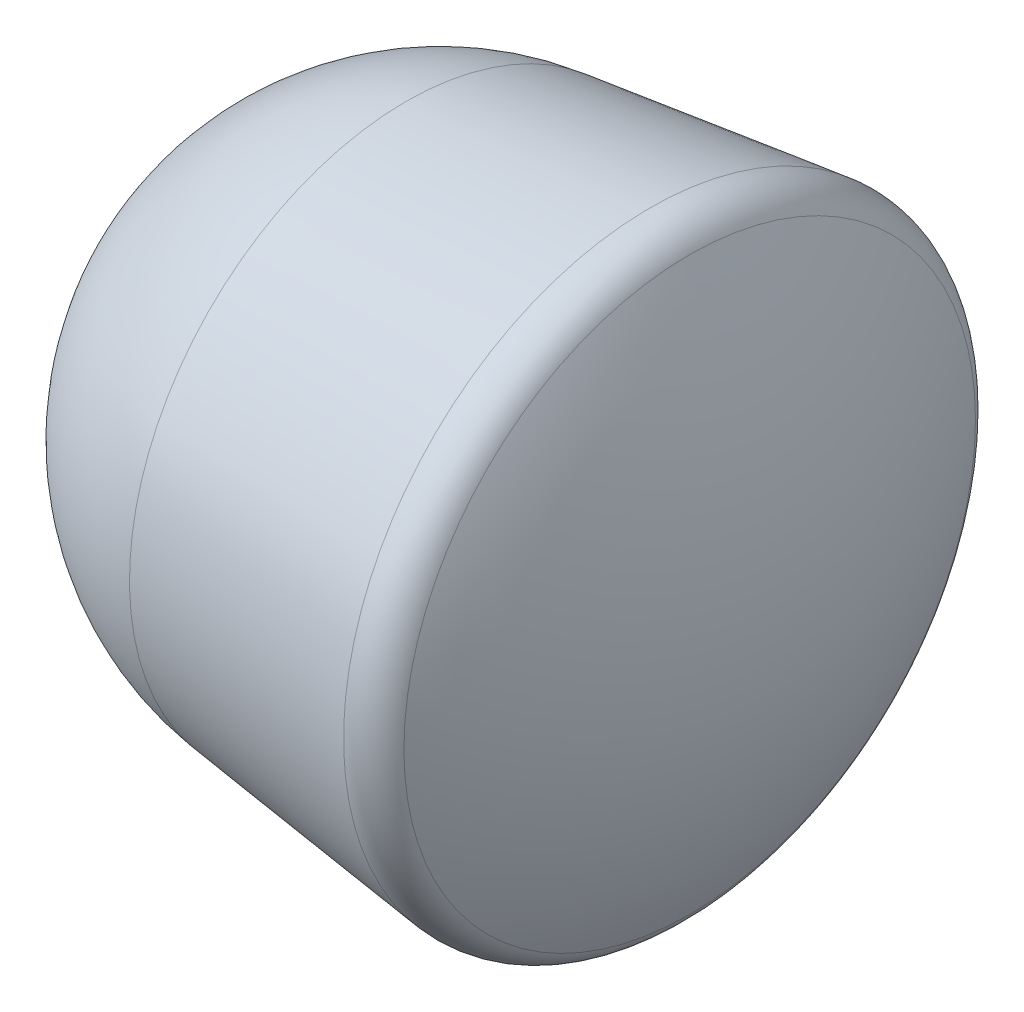
ISO-10303-21;
HEADER;
FILE_DESCRIPTION(('STEP AP214'),'2;1');
FILE_NAME('part.step','',(''),(''),'','','');
FILE_SCHEMA(('AUTOMOTIVE_DESIGN { 1 0 10303 214 1 1 1 1 }'));
ENDSEC;
DATA;
#1=APPLICATION_CONTEXT('core data for automotive mechanical design processes');
#2=APPLICATION_PROTOCOL_DEFINITION('international standard','automotive_design',2000,#1);
#3=PRODUCT_CONTEXT('',#1,'mechanical');
#4=PRODUCT('Part','Part','',(#3));
#5=PRODUCT_RELATED_PRODUCT_CATEGORY('part','',(#4));
#6=PRODUCT_DEFINITION_FORMATION('','',#4);
#7=PRODUCT_DEFINITION_CONTEXT('part definition',#1,'design');
#8=PRODUCT_DEFINITION('design','',#6,#7);
#9=PRODUCT_DEFINITION_SHAPE('','',#8);
#10=(LENGTH_UNIT() NAMED_UNIT(*) SI_UNIT(.MILLI.,.METRE.));
#11=(NAMED_UNIT(*) PLANE_ANGLE_UNIT() SI_UNIT($,.RADIAN.));
#12=(NAMED_UNIT(*) SI_UNIT($,.STERADIAN.) SOLID_ANGLE_UNIT());
#13=UNCERTAINTY_MEASURE_WITH_UNIT(LENGTH_MEASURE(1.E-05),#10,'distance_accuracy_value','');
#14=(GEOMETRIC_REPRESENTATION_CONTEXT(3) GLOBAL_UNCERTAINTY_ASSIGNED_CONTEXT((#13)) GLOBAL_UNIT_ASSIGNED_CONTEXT((#10,
#11,#12)) REPRESENTATION_CONTEXT('',''));
#15=CARTESIAN_POINT('',(0.,0.,0.));
#16=DIRECTION('',(0.,0.,1.));
#17=DIRECTION('',(1.,0.,0.));
#18=AXIS2_PLACEMENT_3D('',#15,#16,#17);
#19=CARTESIAN_POINT('',(998.991394359836,-1.45716771982052E-13,0.));
#20=DIRECTION('',(1.,0.,0.));
#21=DIRECTION('',(0.,1.,0.));
#22=AXIS2_PLACEMENT_3D('',#19,#20,#21);
#23=SPHERICAL_SURFACE('',#22,998.991394359841);
#24=CARTESIAN_POINT('',(877.244969061815,0.,0.));
#25=DIRECTION('',(1.,0.,0.));
#26=DIRECTION('',(0.,0.,-1.));
#27=AXIS2_PLACEMENT_3D('',#24,#25,#26);
#28=CIRCLE('',#27,991.545063994664);
#29=CARTESIAN_POINT('',(877.244969061815,0.,-991.545063994664));
#30=VERTEX_POINT('',#29);
#31=EDGE_CURVE('E10',#30,#30,#28,.T.);
#32=ORIENTED_EDGE('',*,*,#31,.F.);
#33=EDGE_LOOP('',(#32));
#34=FACE_BOUND('',#33,.T.);
#35=ADVANCED_FACE('F39',(#34),#23,.T.);
#36=CARTESIAN_POINT('',(1752.04059845748,0.,0.));
#37=DIRECTION('',(1.,0.,0.));
#38=DIRECTION('',(0.,0.,-1.));
#39=AXIS2_PLACEMENT_3D('',#36,#37,#38);
#40=CONICAL_SURFACE('',#39,1098.95646122979,0.122173047639596);
#41=ORIENTED_EDGE('',*,*,#31,.T.);
#42=EDGE_LOOP('',(#41));
#43=FACE_BOUND('',#42,.T.);
#44=CARTESIAN_POINT('',(1752.04059845748,0.,0.));
#45=DIRECTION('',(1.,0.,0.));
#46=DIRECTION('',(0.,0.,-1.));
#47=AXIS2_PLACEMENT_3D('',#44,#45,#46);
#48=CIRCLE('',#47,1098.95646122979);
#49=CARTESIAN_POINT('',(1752.04059845748,0.,-1098.95646122979));
#50=VERTEX_POINT('',#49);
#51=EDGE_CURVE('E45',#50,#50,#48,.T.);
#52=ORIENTED_EDGE('',*,*,#51,.F.);
#53=EDGE_LOOP('',(#52));
#54=FACE_BOUND('',#53,.T.);
#55=ADVANCED_FACE('F60',(#43,#54),#40,.T.);
#56=CARTESIAN_POINT('',(1769.1023065342,0.,0.));
#57=DIRECTION('',(1.,0.,0.));
#58=DIRECTION('',(0.,0.,-1.));
#59=AXIS2_PLACEMENT_3D('',#56,#57,#58);
#60=TOROIDAL_SURFACE('',#59,960.,140.);
#61=ORIENTED_EDGE('',*,*,#51,.T.);
#62=EDGE_LOOP('',(#61));
#63=FACE_BOUND('',#62,.T.);
#64=CARTESIAN_POINT('',(1893.53873751978,0.,0.));
#65=DIRECTION('',(1.,0.,0.));
#66=DIRECTION('',(0.,0.,-1.));
#67=AXIS2_PLACEMENT_3D('',#64,#65,#66);
#68=CIRCLE('',#67,1024.15274463007);
#69=CARTESIAN_POINT('',(1893.53873751978,0.,-1024.15274463007));
#70=VERTEX_POINT('',#69);
#71=EDGE_CURVE('E49',#70,#70,#68,.T.);
#72=ORIENTED_EDGE('',*,*,#71,.F.);
#73=EDGE_LOOP('',(#72));
#74=FACE_BOUND('',#73,.T.);
#75=ADVANCED_FACE('F58',(#63,#74),#60,.T.);
#76=CARTESIAN_POINT('',(-93.,-2.79290479632266E-13,0.));
#77=DIRECTION('',(1.,0.,0.));
#78=DIRECTION('',(0.,1.,0.));
#79=AXIS2_PLACEMENT_3D('',#76,#77,#78);
#80=SPHERICAL_SURFACE('',#79,2235.);
#81=ORIENTED_EDGE('',*,*,#71,.T.);
#82=EDGE_LOOP('',(#81));
#83=FACE_BOUND('',#82,.T.);
#84=ADVANCED_FACE('F56',(#83),#80,.T.);
#85=CLOSED_SHELL('',(#35,#55,#75,#84));
#86=MANIFOLD_SOLID_BREP('B2',#85);
#87=ADVANCED_BREP_SHAPE_REPRESENTATION('',(#18,#86),#14);
#88=SHAPE_DEFINITION_REPRESENTATION(#9,#87);
ENDSEC;
END-ISO-10303-21;
